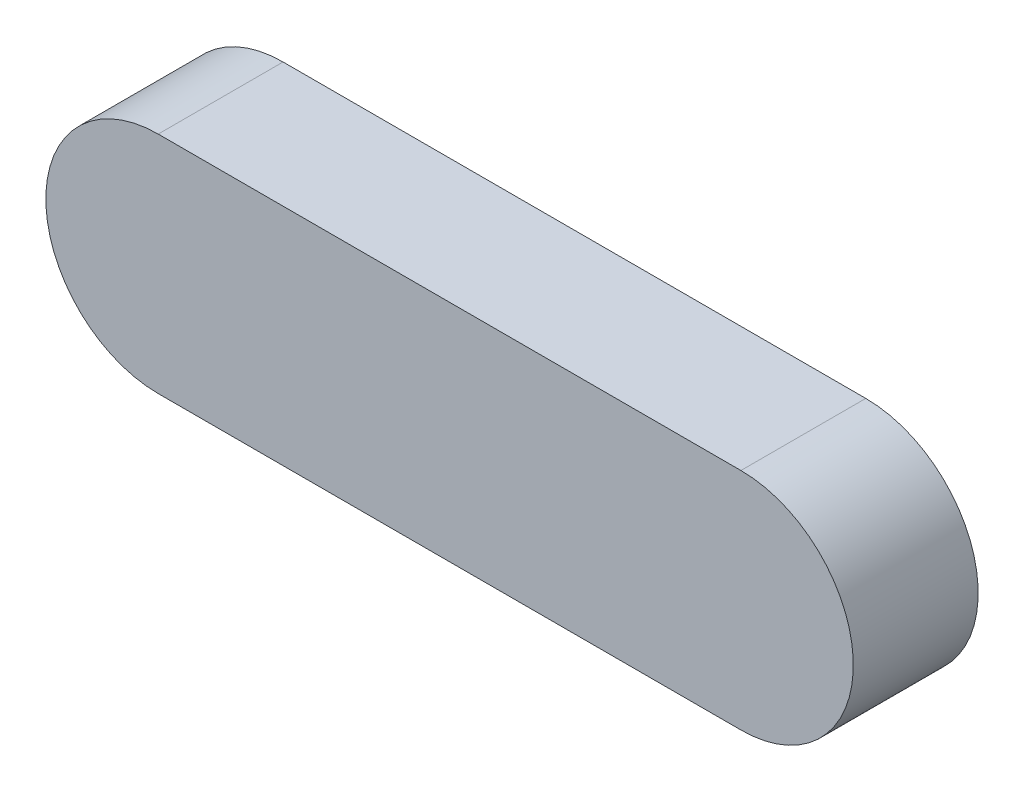
ISO-10303-21;
HEADER;
FILE_DESCRIPTION(('STEP AP214'),'2;1');
FILE_NAME('part.step','',(''),(''),'','','');
FILE_SCHEMA(('AUTOMOTIVE_DESIGN { 1 0 10303 214 1 1 1 1 }'));
ENDSEC;
DATA;
#1=APPLICATION_CONTEXT('core data for automotive mechanical design processes');
#2=APPLICATION_PROTOCOL_DEFINITION('international standard','automotive_design',2000,#1);
#3=PRODUCT_CONTEXT('',#1,'mechanical');
#4=PRODUCT('Part','Part','',(#3));
#5=PRODUCT_RELATED_PRODUCT_CATEGORY('part','',(#4));
#6=PRODUCT_DEFINITION_FORMATION('','',#4);
#7=PRODUCT_DEFINITION_CONTEXT('part definition',#1,'design');
#8=PRODUCT_DEFINITION('design','',#6,#7);
#9=PRODUCT_DEFINITION_SHAPE('','',#8);
#10=(LENGTH_UNIT() NAMED_UNIT(*) SI_UNIT(.MILLI.,.METRE.));
#11=(NAMED_UNIT(*) PLANE_ANGLE_UNIT() SI_UNIT($,.RADIAN.));
#12=(NAMED_UNIT(*) SI_UNIT($,.STERADIAN.) SOLID_ANGLE_UNIT());
#13=UNCERTAINTY_MEASURE_WITH_UNIT(LENGTH_MEASURE(1.E-05),#10,'distance_accuracy_value','');
#14=(GEOMETRIC_REPRESENTATION_CONTEXT(3) GLOBAL_UNCERTAINTY_ASSIGNED_CONTEXT((#13)) GLOBAL_UNIT_ASSIGNED_CONTEXT((#10,
#11,#12)) REPRESENTATION_CONTEXT('',''));
#15=CARTESIAN_POINT('',(0.,0.,0.));
#16=DIRECTION('',(0.,0.,1.));
#17=DIRECTION('',(1.,0.,0.));
#18=AXIS2_PLACEMENT_3D('',#15,#16,#17);
#19=CARTESIAN_POINT('',(15.,225.565015771818,15.));
#20=DIRECTION('',(0.,-1.,0.));
#21=DIRECTION('',(0.,0.,-1.));
#22=AXIS2_PLACEMENT_3D('',#19,#20,#21);
#23=PLANE('',#22);
#24=DIRECTION('',(-1.,0.,0.));
#25=VECTOR('',#24,1.);
#26=CARTESIAN_POINT('',(15.,225.565015771818,0.));
#27=LINE('',#26,#25);
#28=CARTESIAN_POINT('',(50.,225.565015771818,0.));
#29=VERTEX_POINT('',#28);
#30=CARTESIAN_POINT('',(-20.,225.565015771818,0.));
#31=VERTEX_POINT('',#30);
#32=EDGE_CURVE('E95',#29,#31,#27,.T.);
#33=ORIENTED_EDGE('',*,*,#32,.T.);
#34=DIRECTION('',(0.,0.,-1.));
#35=VECTOR('',#34,1.);
#36=CARTESIAN_POINT('',(-20.,225.565015771818,15.));
#37=LINE('',#36,#35);
#38=CARTESIAN_POINT('',(-20.,225.565015771818,15.));
#39=VERTEX_POINT('',#38);
#40=EDGE_CURVE('E11',#39,#31,#37,.T.);
#41=ORIENTED_EDGE('',*,*,#40,.F.);
#42=DIRECTION('',(-1.,0.,0.));
#43=VECTOR('',#42,1.);
#44=CARTESIAN_POINT('',(15.,225.565015771818,15.));
#45=LINE('',#44,#43);
#46=CARTESIAN_POINT('',(50.,225.565015771818,15.));
#47=VERTEX_POINT('',#46);
#48=EDGE_CURVE('E80',#47,#39,#45,.T.);
#49=ORIENTED_EDGE('',*,*,#48,.F.);
#50=DIRECTION('',(0.,0.,-1.));
#51=VECTOR('',#50,1.);
#52=CARTESIAN_POINT('',(50.,225.565015771818,15.));
#53=LINE('',#52,#51);
#54=EDGE_CURVE('E91',#47,#29,#53,.T.);
#55=ORIENTED_EDGE('',*,*,#54,.T.);
#56=EDGE_LOOP('',(#33,#41,#49,#55));
#57=FACE_BOUND('',#56,.T.);
#58=ADVANCED_FACE('F33',(#57),#23,.F.);
#59=CARTESIAN_POINT('',(-20.,212.065015771818,15.));
#60=DIRECTION('',(0.,0.,-1.));
#61=DIRECTION('',(-1.,0.,0.));
#62=AXIS2_PLACEMENT_3D('',#59,#60,#61);
#63=CYLINDRICAL_SURFACE('',#62,13.5);
#64=CARTESIAN_POINT('',(-20.,212.065015771818,0.));
#65=DIRECTION('',(0.,0.,1.));
#66=DIRECTION('',(1.,0.,0.));
#67=AXIS2_PLACEMENT_3D('',#64,#65,#66);
#68=CIRCLE('',#67,13.5);
#69=CARTESIAN_POINT('',(-20.,198.565015771818,0.));
#70=VERTEX_POINT('',#69);
#71=EDGE_CURVE('E85',#31,#70,#68,.T.);
#72=ORIENTED_EDGE('',*,*,#71,.T.);
#73=DIRECTION('',(0.,0.,-1.));
#74=VECTOR('',#73,1.);
#75=CARTESIAN_POINT('',(-20.,198.565015771818,15.));
#76=LINE('',#75,#74);
#77=CARTESIAN_POINT('',(-20.,198.565015771818,15.));
#78=VERTEX_POINT('',#77);
#79=EDGE_CURVE('E41',#78,#70,#76,.T.);
#80=ORIENTED_EDGE('',*,*,#79,.F.);
#81=CARTESIAN_POINT('',(-20.,212.065015771818,15.));
#82=DIRECTION('',(0.,0.,1.));
#83=DIRECTION('',(1.,0.,0.));
#84=AXIS2_PLACEMENT_3D('',#81,#82,#83);
#85=CIRCLE('',#84,13.5);
#86=EDGE_CURVE('E75',#39,#78,#85,.T.);
#87=ORIENTED_EDGE('',*,*,#86,.F.);
#88=ORIENTED_EDGE('',*,*,#40,.T.);
#89=EDGE_LOOP('',(#72,#80,#87,#88));
#90=FACE_BOUND('',#89,.T.);
#91=ADVANCED_FACE('F84',(#90),#63,.T.);
#92=CARTESIAN_POINT('',(15.,198.565015771818,15.));
#93=DIRECTION('',(0.,-1.,0.));
#94=DIRECTION('',(0.,0.,-1.));
#95=AXIS2_PLACEMENT_3D('',#92,#93,#94);
#96=PLANE('',#95);
#97=DIRECTION('',(-1.,0.,0.));
#98=VECTOR('',#97,1.);
#99=CARTESIAN_POINT('',(15.,198.565015771818,0.));
#100=LINE('',#99,#98);
#101=CARTESIAN_POINT('',(50.,198.565015771818,0.));
#102=VERTEX_POINT('',#101);
#103=EDGE_CURVE('E100',#102,#70,#100,.T.);
#104=ORIENTED_EDGE('',*,*,#103,.F.);
#105=DIRECTION('',(0.,0.,-1.));
#106=VECTOR('',#105,1.);
#107=CARTESIAN_POINT('',(50.,198.565015771818,15.));
#108=LINE('',#107,#106);
#109=CARTESIAN_POINT('',(50.,198.565015771818,15.));
#110=VERTEX_POINT('',#109);
#111=EDGE_CURVE('E65',#110,#102,#108,.T.);
#112=ORIENTED_EDGE('',*,*,#111,.F.);
#113=DIRECTION('',(-1.,0.,0.));
#114=VECTOR('',#113,1.);
#115=CARTESIAN_POINT('',(15.,198.565015771818,15.));
#116=LINE('',#115,#114);
#117=EDGE_CURVE('E78',#110,#78,#116,.T.);
#118=ORIENTED_EDGE('',*,*,#117,.T.);
#119=ORIENTED_EDGE('',*,*,#79,.T.);
#120=EDGE_LOOP('',(#104,#112,#118,#119));
#121=FACE_BOUND('',#120,.T.);
#122=ADVANCED_FACE('F89',(#121),#96,.T.);
#123=CARTESIAN_POINT('',(50.,212.065015771818,15.));
#124=DIRECTION('',(0.,0.,-1.));
#125=DIRECTION('',(-1.,0.,0.));
#126=AXIS2_PLACEMENT_3D('',#123,#124,#125);
#127=CYLINDRICAL_SURFACE('',#126,13.5);
#128=CARTESIAN_POINT('',(50.,212.065015771818,0.));
#129=DIRECTION('',(0.,0.,1.));
#130=DIRECTION('',(1.,0.,0.));
#131=AXIS2_PLACEMENT_3D('',#128,#129,#130);
#132=CIRCLE('',#131,13.5);
#133=EDGE_CURVE('E68',#102,#29,#132,.T.);
#134=ORIENTED_EDGE('',*,*,#133,.T.);
#135=ORIENTED_EDGE('',*,*,#54,.F.);
#136=CARTESIAN_POINT('',(50.,212.065015771818,15.));
#137=DIRECTION('',(0.,0.,1.));
#138=DIRECTION('',(1.,0.,0.));
#139=AXIS2_PLACEMENT_3D('',#136,#137,#138);
#140=CIRCLE('',#139,13.5);
#141=EDGE_CURVE('E49',#110,#47,#140,.T.);
#142=ORIENTED_EDGE('',*,*,#141,.F.);
#143=ORIENTED_EDGE('',*,*,#111,.T.);
#144=EDGE_LOOP('',(#134,#135,#142,#143));
#145=FACE_BOUND('',#144,.T.);
#146=ADVANCED_FACE('F119',(#145),#127,.T.);
#147=CARTESIAN_POINT('',(15.,133.606993365739,15.));
#148=DIRECTION('',(0.,0.,1.));
#149=DIRECTION('',(1.,0.,0.));
#150=AXIS2_PLACEMENT_3D('',#147,#148,#149);
#151=PLANE('',#150);
#152=ORIENTED_EDGE('',*,*,#48,.T.);
#153=ORIENTED_EDGE('',*,*,#86,.T.);
#154=ORIENTED_EDGE('',*,*,#117,.F.);
#155=ORIENTED_EDGE('',*,*,#141,.T.);
#156=EDGE_LOOP('',(#152,#153,#154,#155));
#157=FACE_BOUND('',#156,.T.);
#158=ADVANCED_FACE('F76',(#157),#151,.T.);
#159=CARTESIAN_POINT('',(15.,133.606993365739,0.));
#160=DIRECTION('',(0.,0.,1.));
#161=DIRECTION('',(1.,0.,0.));
#162=AXIS2_PLACEMENT_3D('',#159,#160,#161);
#163=PLANE('',#162);
#164=CARTESIAN_POINT('',(15.,212.065015771818,0.));
#165=DIRECTION('',(0.,0.,-1.));
#166=DIRECTION('',(-1.,0.,0.));
#167=AXIS2_PLACEMENT_3D('',#164,#165,#166);
#168=CIRCLE('',#167,10.);
#169=CARTESIAN_POINT('',(4.99999999999999,212.065015771818,0.));
#170=VERTEX_POINT('',#169);
#171=EDGE_CURVE('E168',#170,#170,#168,.T.);
#172=ORIENTED_EDGE('',*,*,#171,.F.);
#173=EDGE_LOOP('',(#172));
#174=FACE_BOUND('',#173,.T.);
#175=ORIENTED_EDGE('',*,*,#32,.F.);
#176=ORIENTED_EDGE('',*,*,#133,.F.);
#177=ORIENTED_EDGE('',*,*,#103,.T.);
#178=ORIENTED_EDGE('',*,*,#71,.F.);
#179=EDGE_LOOP('',(#175,#176,#177,#178));
#180=FACE_BOUND('',#179,.T.);
#181=ADVANCED_FACE('F107',(#174,#180),#163,.F.);
#182=CARTESIAN_POINT('',(15.,212.065015771818,10.));
#183=DIRECTION('',(0.,0.,-1.));
#184=DIRECTION('',(-1.,0.,0.));
#185=AXIS2_PLACEMENT_3D('',#182,#183,#184);
#186=CYLINDRICAL_SURFACE('',#185,10.);
#187=CARTESIAN_POINT('',(15.,212.065015771818,10.));
#188=DIRECTION('',(0.,0.,-1.));
#189=DIRECTION('',(-1.,0.,0.));
#190=AXIS2_PLACEMENT_3D('',#187,#188,#189);
#191=CIRCLE('',#190,10.);
#192=CARTESIAN_POINT('',(4.99999999999999,212.065015771818,10.));
#193=VERTEX_POINT('',#192);
#194=EDGE_CURVE('E98',#193,#193,#191,.T.);
#195=ORIENTED_EDGE('',*,*,#194,.F.);
#196=EDGE_LOOP('',(#195));
#197=FACE_BOUND('',#196,.T.);
#198=ORIENTED_EDGE('',*,*,#171,.T.);
#199=EDGE_LOOP('',(#198));
#200=FACE_BOUND('',#199,.T.);
#201=ADVANCED_FACE('F109',(#197,#200),#186,.F.);
#202=CARTESIAN_POINT('',(15.,212.065015771818,10.));
#203=DIRECTION('',(0.,0.,-1.));
#204=DIRECTION('',(-1.,0.,0.));
#205=AXIS2_PLACEMENT_3D('',#202,#203,#204);
#206=PLANE('',#205);
#207=ORIENTED_EDGE('',*,*,#194,.T.);
#208=EDGE_LOOP('',(#207));
#209=FACE_BOUND('',#208,.T.);
#210=ADVANCED_FACE('F116',(#209),#206,.T.);
#211=CLOSED_SHELL('',(#58,#91,#122,#146,#158,#181,#201,#210));
#212=MANIFOLD_SOLID_BREP('B2',#211);
#213=ADVANCED_BREP_SHAPE_REPRESENTATION('',(#18,#212),#14);
#214=SHAPE_DEFINITION_REPRESENTATION(#9,#213);
ENDSEC;
END-ISO-10303-21;
